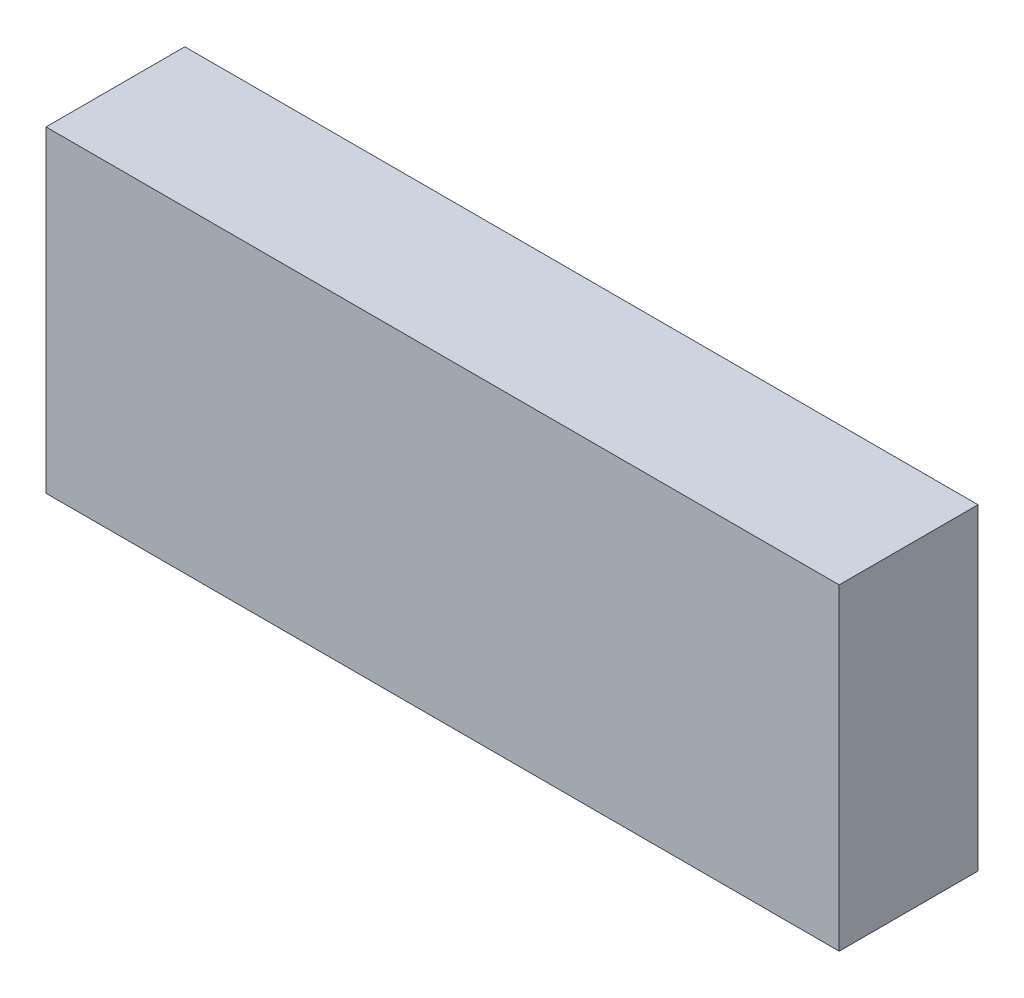
ISO-10303-21;
HEADER;
FILE_DESCRIPTION(('STEP AP214'),'2;1');
FILE_NAME('part.step','',(''),(''),'','','');
FILE_SCHEMA(('AUTOMOTIVE_DESIGN { 1 0 10303 214 1 1 1 1 }'));
ENDSEC;
DATA;
#1=APPLICATION_CONTEXT('core data for automotive mechanical design processes');
#2=APPLICATION_PROTOCOL_DEFINITION('international standard','automotive_design',2000,#1);
#3=PRODUCT_CONTEXT('',#1,'mechanical');
#4=PRODUCT('Part','Part','',(#3));
#5=PRODUCT_RELATED_PRODUCT_CATEGORY('part','',(#4));
#6=PRODUCT_DEFINITION_FORMATION('','',#4);
#7=PRODUCT_DEFINITION_CONTEXT('part definition',#1,'design');
#8=PRODUCT_DEFINITION('design','',#6,#7);
#9=PRODUCT_DEFINITION_SHAPE('','',#8);
#10=(LENGTH_UNIT() NAMED_UNIT(*) SI_UNIT(.MILLI.,.METRE.));
#11=(NAMED_UNIT(*) PLANE_ANGLE_UNIT() SI_UNIT($,.RADIAN.));
#12=(NAMED_UNIT(*) SI_UNIT($,.STERADIAN.) SOLID_ANGLE_UNIT());
#13=UNCERTAINTY_MEASURE_WITH_UNIT(LENGTH_MEASURE(1.E-05),#10,'distance_accuracy_value','');
#14=(GEOMETRIC_REPRESENTATION_CONTEXT(3) GLOBAL_UNCERTAINTY_ASSIGNED_CONTEXT((#13)) GLOBAL_UNIT_ASSIGNED_CONTEXT((#10,
#11,#12)) REPRESENTATION_CONTEXT('',''));
#15=CARTESIAN_POINT('',(0.,0.,0.));
#16=DIRECTION('',(0.,0.,1.));
#17=DIRECTION('',(1.,0.,0.));
#18=AXIS2_PLACEMENT_3D('',#15,#16,#17);
#19=CARTESIAN_POINT('',(-40.,-16.,14.));
#20=DIRECTION('',(0.,0.,1.));
#21=DIRECTION('',(1.,0.,0.));
#22=AXIS2_PLACEMENT_3D('',#19,#20,#21);
#23=PLANE('',#22);
#24=DIRECTION('',(0.,1.,0.));
#25=VECTOR('',#24,1.);
#26=CARTESIAN_POINT('',(-40.,-16.,14.));
#27=LINE('',#26,#25);
#28=CARTESIAN_POINT('',(-40.,-16.,14.));
#29=VERTEX_POINT('',#28);
#30=CARTESIAN_POINT('',(-40.,16.,14.));
#31=VERTEX_POINT('',#30);
#32=EDGE_CURVE('E87',#29,#31,#27,.T.);
#33=ORIENTED_EDGE('',*,*,#32,.F.);
#34=DIRECTION('',(1.,0.,0.));
#35=VECTOR('',#34,1.);
#36=CARTESIAN_POINT('',(-40.,-16.,14.));
#37=LINE('',#36,#35);
#38=CARTESIAN_POINT('',(40.,-16.,14.));
#39=VERTEX_POINT('',#38);
#40=EDGE_CURVE('E69',#29,#39,#37,.T.);
#41=ORIENTED_EDGE('',*,*,#40,.T.);
#42=DIRECTION('',(0.,1.,0.));
#43=VECTOR('',#42,1.);
#44=CARTESIAN_POINT('',(40.,-16.,14.));
#45=LINE('',#44,#43);
#46=CARTESIAN_POINT('',(40.,16.,14.));
#47=VERTEX_POINT('',#46);
#48=EDGE_CURVE('E81',#39,#47,#45,.T.);
#49=ORIENTED_EDGE('',*,*,#48,.T.);
#50=DIRECTION('',(1.,0.,0.));
#51=VECTOR('',#50,1.);
#52=CARTESIAN_POINT('',(-40.,16.,14.));
#53=LINE('',#52,#51);
#54=EDGE_CURVE('E11',#31,#47,#53,.T.);
#55=ORIENTED_EDGE('',*,*,#54,.F.);
#56=EDGE_LOOP('',(#33,#41,#49,#55));
#57=FACE_BOUND('',#56,.T.);
#58=ADVANCED_FACE('F17',(#57),#23,.T.);
#59=CARTESIAN_POINT('',(-40.,-16.,0.));
#60=DIRECTION('',(0.,0.,1.));
#61=DIRECTION('',(1.,0.,0.));
#62=AXIS2_PLACEMENT_3D('',#59,#60,#61);
#63=PLANE('',#62);
#64=DIRECTION('',(1.,0.,0.));
#65=VECTOR('',#64,1.);
#66=CARTESIAN_POINT('',(-40.,16.,0.));
#67=LINE('',#66,#65);
#68=CARTESIAN_POINT('',(-40.,16.,0.));
#69=VERTEX_POINT('',#68);
#70=CARTESIAN_POINT('',(40.,16.,0.));
#71=VERTEX_POINT('',#70);
#72=EDGE_CURVE('E20',#69,#71,#67,.T.);
#73=ORIENTED_EDGE('',*,*,#72,.T.);
#74=DIRECTION('',(0.,1.,0.));
#75=VECTOR('',#74,1.);
#76=CARTESIAN_POINT('',(40.,-16.,0.));
#77=LINE('',#76,#75);
#78=CARTESIAN_POINT('',(40.,-16.,0.));
#79=VERTEX_POINT('',#78);
#80=EDGE_CURVE('E104',#79,#71,#77,.T.);
#81=ORIENTED_EDGE('',*,*,#80,.F.);
#82=DIRECTION('',(1.,0.,0.));
#83=VECTOR('',#82,1.);
#84=CARTESIAN_POINT('',(-40.,-16.,0.));
#85=LINE('',#84,#83);
#86=CARTESIAN_POINT('',(-40.,-16.,0.));
#87=VERTEX_POINT('',#86);
#88=EDGE_CURVE('E80',#87,#79,#85,.T.);
#89=ORIENTED_EDGE('',*,*,#88,.F.);
#90=DIRECTION('',(0.,1.,0.));
#91=VECTOR('',#90,1.);
#92=CARTESIAN_POINT('',(-40.,-16.,0.));
#93=LINE('',#92,#91);
#94=EDGE_CURVE('E88',#87,#69,#93,.T.);
#95=ORIENTED_EDGE('',*,*,#94,.T.);
#96=EDGE_LOOP('',(#73,#81,#89,#95));
#97=FACE_BOUND('',#96,.T.);
#98=ADVANCED_FACE('F149',(#97),#63,.F.);
#99=CARTESIAN_POINT('',(-40.,16.,0.));
#100=DIRECTION('',(0.,1.,0.));
#101=DIRECTION('',(1.,0.,0.));
#102=AXIS2_PLACEMENT_3D('',#99,#100,#101);
#103=PLANE('',#102);
#104=ORIENTED_EDGE('',*,*,#72,.F.);
#105=DIRECTION('',(0.,0.,1.));
#106=VECTOR('',#105,1.);
#107=CARTESIAN_POINT('',(-40.,16.,0.));
#108=LINE('',#107,#106);
#109=EDGE_CURVE('E92',#69,#31,#108,.T.);
#110=ORIENTED_EDGE('',*,*,#109,.T.);
#111=ORIENTED_EDGE('',*,*,#54,.T.);
#112=DIRECTION('',(0.,0.,1.));
#113=VECTOR('',#112,1.);
#114=CARTESIAN_POINT('',(40.,16.,0.));
#115=LINE('',#114,#113);
#116=EDGE_CURVE('E108',#71,#47,#115,.T.);
#117=ORIENTED_EDGE('',*,*,#116,.F.);
#118=EDGE_LOOP('',(#104,#110,#111,#117));
#119=FACE_BOUND('',#118,.T.);
#120=ADVANCED_FACE('F134',(#119),#103,.T.);
#121=CARTESIAN_POINT('',(-40.,-16.,0.));
#122=DIRECTION('',(0.,1.,0.));
#123=DIRECTION('',(1.,0.,0.));
#124=AXIS2_PLACEMENT_3D('',#121,#122,#123);
#125=PLANE('',#124);
#126=DIRECTION('',(0.,0.,1.));
#127=VECTOR('',#126,1.);
#128=CARTESIAN_POINT('',(40.,-16.,0.));
#129=LINE('',#128,#127);
#130=EDGE_CURVE('E75',#79,#39,#129,.T.);
#131=ORIENTED_EDGE('',*,*,#130,.T.);
#132=ORIENTED_EDGE('',*,*,#40,.F.);
#133=DIRECTION('',(0.,0.,1.));
#134=VECTOR('',#133,1.);
#135=CARTESIAN_POINT('',(-40.,-16.,0.));
#136=LINE('',#135,#134);
#137=EDGE_CURVE('E72',#87,#29,#136,.T.);
#138=ORIENTED_EDGE('',*,*,#137,.F.);
#139=ORIENTED_EDGE('',*,*,#88,.T.);
#140=EDGE_LOOP('',(#131,#132,#138,#139));
#141=FACE_BOUND('',#140,.T.);
#142=ADVANCED_FACE('F71',(#141),#125,.F.);
#143=CARTESIAN_POINT('',(40.,-16.,0.));
#144=DIRECTION('',(1.,0.,0.));
#145=DIRECTION('',(0.,1.,0.));
#146=AXIS2_PLACEMENT_3D('',#143,#144,#145);
#147=PLANE('',#146);
#148=ORIENTED_EDGE('',*,*,#130,.F.);
#149=ORIENTED_EDGE('',*,*,#80,.T.);
#150=ORIENTED_EDGE('',*,*,#116,.T.);
#151=ORIENTED_EDGE('',*,*,#48,.F.);
#152=EDGE_LOOP('',(#148,#149,#150,#151));
#153=FACE_BOUND('',#152,.T.);
#154=ADVANCED_FACE('F124',(#153),#147,.T.);
#155=CARTESIAN_POINT('',(-40.,-16.,0.));
#156=DIRECTION('',(1.,0.,0.));
#157=DIRECTION('',(0.,1.,0.));
#158=AXIS2_PLACEMENT_3D('',#155,#156,#157);
#159=PLANE('',#158);
#160=ORIENTED_EDGE('',*,*,#32,.T.);
#161=ORIENTED_EDGE('',*,*,#109,.F.);
#162=ORIENTED_EDGE('',*,*,#94,.F.);
#163=ORIENTED_EDGE('',*,*,#137,.T.);
#164=EDGE_LOOP('',(#160,#161,#162,#163));
#165=FACE_BOUND('',#164,.T.);
#166=ADVANCED_FACE('F85',(#165),#159,.F.);
#167=CLOSED_SHELL('',(#58,#98,#120,#142,#154,#166));
#168=MANIFOLD_SOLID_BREP('B1',#167);
#169=ADVANCED_BREP_SHAPE_REPRESENTATION('',(#18,#168),#14);
#170=SHAPE_DEFINITION_REPRESENTATION(#9,#169);
ENDSEC;
END-ISO-10303-21;
